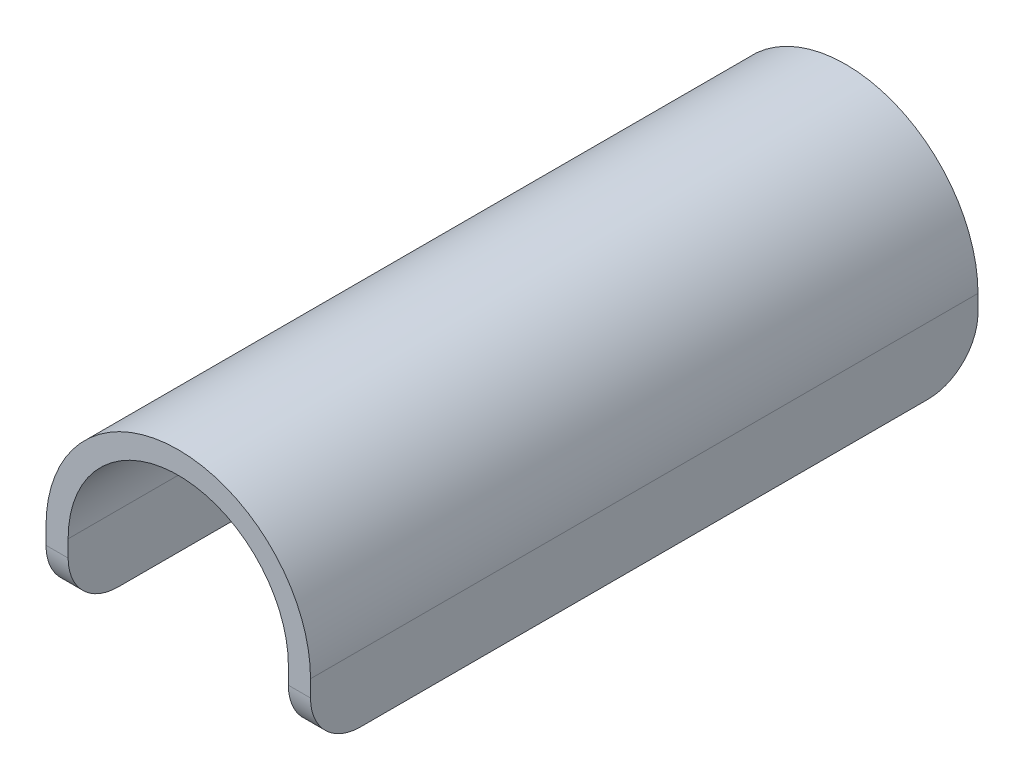
ISO-10303-21;
HEADER;
FILE_DESCRIPTION(('STEP AP214'),'2;1');
FILE_NAME('part.step','',(''),(''),'','','');
FILE_SCHEMA(('AUTOMOTIVE_DESIGN { 1 0 10303 214 1 1 1 1 }'));
ENDSEC;
DATA;
#1=APPLICATION_CONTEXT('core data for automotive mechanical design processes');
#2=APPLICATION_PROTOCOL_DEFINITION('international standard','automotive_design',2000,#1);
#3=PRODUCT_CONTEXT('',#1,'mechanical');
#4=PRODUCT('Part','Part','',(#3));
#5=PRODUCT_RELATED_PRODUCT_CATEGORY('part','',(#4));
#6=PRODUCT_DEFINITION_FORMATION('','',#4);
#7=PRODUCT_DEFINITION_CONTEXT('part definition',#1,'design');
#8=PRODUCT_DEFINITION('design','',#6,#7);
#9=PRODUCT_DEFINITION_SHAPE('','',#8);
#10=(LENGTH_UNIT() NAMED_UNIT(*) SI_UNIT(.MILLI.,.METRE.));
#11=(NAMED_UNIT(*) PLANE_ANGLE_UNIT() SI_UNIT($,.RADIAN.));
#12=(NAMED_UNIT(*) SI_UNIT($,.STERADIAN.) SOLID_ANGLE_UNIT());
#13=UNCERTAINTY_MEASURE_WITH_UNIT(LENGTH_MEASURE(1.E-05),#10,'distance_accuracy_value','');
#14=(GEOMETRIC_REPRESENTATION_CONTEXT(3) GLOBAL_UNCERTAINTY_ASSIGNED_CONTEXT((#13)) GLOBAL_UNIT_ASSIGNED_CONTEXT((#10,
#11,#12)) REPRESENTATION_CONTEXT('',''));
#15=CARTESIAN_POINT('',(0.,0.,0.));
#16=DIRECTION('',(0.,0.,1.));
#17=DIRECTION('',(1.,0.,0.));
#18=AXIS2_PLACEMENT_3D('',#15,#16,#17);
#19=CARTESIAN_POINT('',(0.,0.,200.));
#20=DIRECTION('',(0.,0.,-1.));
#21=DIRECTION('',(-1.,0.,0.));
#22=AXIS2_PLACEMENT_3D('',#19,#20,#21);
#23=CYLINDRICAL_SURFACE('',#22,39.6280261693038);
#24=CARTESIAN_POINT('',(0.,0.,0.));
#25=DIRECTION('',(0.,0.,1.));
#26=DIRECTION('',(1.,0.,0.));
#27=AXIS2_PLACEMENT_3D('',#24,#25,#26);
#28=CIRCLE('',#27,39.6280261693038);
#29=CARTESIAN_POINT('',(39.6280261693038,0.,0.));
#30=VERTEX_POINT('',#29);
#31=CARTESIAN_POINT('',(-39.6280261693038,0.,0.));
#32=VERTEX_POINT('',#31);
#33=EDGE_CURVE('E145',#30,#32,#28,.T.);
#34=ORIENTED_EDGE('',*,*,#33,.T.);
#35=DIRECTION('',(0.,0.,-1.));
#36=VECTOR('',#35,1.);
#37=CARTESIAN_POINT('',(-39.6280261693038,0.,200.));
#38=LINE('',#37,#36);
#39=CARTESIAN_POINT('',(-39.6280261693038,0.,200.));
#40=VERTEX_POINT('',#39);
#41=EDGE_CURVE('E174',#40,#32,#38,.T.);
#42=ORIENTED_EDGE('',*,*,#41,.F.);
#43=CARTESIAN_POINT('',(0.,0.,200.));
#44=DIRECTION('',(0.,0.,1.));
#45=DIRECTION('',(1.,0.,0.));
#46=AXIS2_PLACEMENT_3D('',#43,#44,#45);
#47=CIRCLE('',#46,39.6280261693038);
#48=CARTESIAN_POINT('',(39.6280261693038,0.,200.));
#49=VERTEX_POINT('',#48);
#50=EDGE_CURVE('E158',#49,#40,#47,.T.);
#51=ORIENTED_EDGE('',*,*,#50,.F.);
#52=DIRECTION('',(0.,0.,-1.));
#53=VECTOR('',#52,1.);
#54=CARTESIAN_POINT('',(39.6280261693038,0.,200.));
#55=LINE('',#54,#53);
#56=EDGE_CURVE('E136',#49,#30,#55,.T.);
#57=ORIENTED_EDGE('',*,*,#56,.T.);
#58=EDGE_LOOP('',(#34,#42,#51,#57));
#59=FACE_BOUND('',#58,.T.);
#60=ADVANCED_FACE('F38',(#59),#23,.T.);
#61=CARTESIAN_POINT('',(0.,0.,200.));
#62=DIRECTION('',(0.,0.,-1.));
#63=DIRECTION('',(-1.,0.,0.));
#64=AXIS2_PLACEMENT_3D('',#61,#62,#63);
#65=CYLINDRICAL_SURFACE('',#64,33.);
#66=CARTESIAN_POINT('',(0.,0.,0.));
#67=DIRECTION('',(0.,0.,-1.));
#68=DIRECTION('',(1.,0.,0.));
#69=AXIS2_PLACEMENT_3D('',#66,#67,#68);
#70=CIRCLE('',#69,33.);
#71=CARTESIAN_POINT('',(-33.,0.,0.));
#72=VERTEX_POINT('',#71);
#73=CARTESIAN_POINT('',(33.,0.,0.));
#74=VERTEX_POINT('',#73);
#75=EDGE_CURVE('E154',#72,#74,#70,.T.);
#76=ORIENTED_EDGE('',*,*,#75,.T.);
#77=DIRECTION('',(0.,0.,-1.));
#78=VECTOR('',#77,1.);
#79=CARTESIAN_POINT('',(33.,0.,200.));
#80=LINE('',#79,#78);
#81=CARTESIAN_POINT('',(33.,0.,200.));
#82=VERTEX_POINT('',#81);
#83=EDGE_CURVE('E160',#82,#74,#80,.T.);
#84=ORIENTED_EDGE('',*,*,#83,.F.);
#85=CARTESIAN_POINT('',(0.,0.,200.));
#86=DIRECTION('',(0.,0.,-1.));
#87=DIRECTION('',(1.,0.,0.));
#88=AXIS2_PLACEMENT_3D('',#85,#86,#87);
#89=CIRCLE('',#88,33.);
#90=CARTESIAN_POINT('',(-33.,0.,200.));
#91=VERTEX_POINT('',#90);
#92=EDGE_CURVE('E161',#91,#82,#89,.T.);
#93=ORIENTED_EDGE('',*,*,#92,.F.);
#94=DIRECTION('',(0.,0.,-1.));
#95=VECTOR('',#94,1.);
#96=CARTESIAN_POINT('',(-33.,0.,200.));
#97=LINE('',#96,#95);
#98=EDGE_CURVE('E166',#91,#72,#97,.T.);
#99=ORIENTED_EDGE('',*,*,#98,.T.);
#100=EDGE_LOOP('',(#76,#84,#93,#99));
#101=FACE_BOUND('',#100,.T.);
#102=ADVANCED_FACE('F259',(#101),#65,.F.);
#103=CARTESIAN_POINT('',(0.,0.,200.));
#104=DIRECTION('',(0.,0.,1.));
#105=DIRECTION('',(1.,0.,0.));
#106=AXIS2_PLACEMENT_3D('',#103,#104,#105);
#107=PLANE('',#106);
#108=DIRECTION('',(0.,-1.,0.));
#109=VECTOR('',#108,1.);
#110=CARTESIAN_POINT('',(33.,0.,200.));
#111=LINE('',#110,#109);
#112=CARTESIAN_POINT('',(33.,-5.,200.));
#113=VERTEX_POINT('',#112);
#114=EDGE_CURVE('E141',#82,#113,#111,.T.);
#115=ORIENTED_EDGE('',*,*,#114,.T.);
#116=DIRECTION('',(1.,0.,0.));
#117=VECTOR('',#116,1.);
#118=CARTESIAN_POINT('',(39.6280261693038,-5.,200.));
#119=LINE('',#118,#117);
#120=CARTESIAN_POINT('',(39.6280261693038,-5.,200.));
#121=VERTEX_POINT('',#120);
#122=EDGE_CURVE('E11',#113,#121,#119,.T.);
#123=ORIENTED_EDGE('',*,*,#122,.T.);
#124=DIRECTION('',(0.,1.,0.));
#125=VECTOR('',#124,1.);
#126=CARTESIAN_POINT('',(39.6280261693038,-20.,200.));
#127=LINE('',#126,#125);
#128=EDGE_CURVE('E266',#121,#49,#127,.T.);
#129=ORIENTED_EDGE('',*,*,#128,.T.);
#130=ORIENTED_EDGE('',*,*,#50,.T.);
#131=DIRECTION('',(0.,-1.,0.));
#132=VECTOR('',#131,1.);
#133=CARTESIAN_POINT('',(-39.6280261693038,0.,200.));
#134=LINE('',#133,#132);
#135=CARTESIAN_POINT('',(-39.6280261693038,-5.,200.));
#136=VERTEX_POINT('',#135);
#137=EDGE_CURVE('E227',#40,#136,#134,.T.);
#138=ORIENTED_EDGE('',*,*,#137,.T.);
#139=DIRECTION('',(1.,0.,0.));
#140=VECTOR('',#139,1.);
#141=CARTESIAN_POINT('',(-33.,-5.,200.));
#142=LINE('',#141,#140);
#143=CARTESIAN_POINT('',(-33.,-5.,200.));
#144=VERTEX_POINT('',#143);
#145=EDGE_CURVE('E47',#136,#144,#142,.T.);
#146=ORIENTED_EDGE('',*,*,#145,.T.);
#147=DIRECTION('',(0.,1.,0.));
#148=VECTOR('',#147,1.);
#149=CARTESIAN_POINT('',(-33.,0.,200.));
#150=LINE('',#149,#148);
#151=EDGE_CURVE('E224',#144,#91,#150,.T.);
#152=ORIENTED_EDGE('',*,*,#151,.T.);
#153=ORIENTED_EDGE('',*,*,#92,.T.);
#154=EDGE_LOOP('',(#115,#123,#129,#130,#138,#146,#152,#153));
#155=FACE_BOUND('',#154,.T.);
#156=ADVANCED_FACE('F223',(#155),#107,.T.);
#157=CARTESIAN_POINT('',(0.,0.,0.));
#158=DIRECTION('',(0.,0.,1.));
#159=DIRECTION('',(1.,0.,0.));
#160=AXIS2_PLACEMENT_3D('',#157,#158,#159);
#161=PLANE('',#160);
#162=DIRECTION('',(0.,1.,0.));
#163=VECTOR('',#162,1.);
#164=CARTESIAN_POINT('',(-33.,0.,0.));
#165=LINE('',#164,#163);
#166=CARTESIAN_POINT('',(-33.,-5.,0.));
#167=VERTEX_POINT('',#166);
#168=EDGE_CURVE('E241',#167,#72,#165,.T.);
#169=ORIENTED_EDGE('',*,*,#168,.F.);
#170=DIRECTION('',(1.,0.,0.));
#171=VECTOR('',#170,1.);
#172=CARTESIAN_POINT('',(0.,-5.,0.));
#173=LINE('',#172,#171);
#174=CARTESIAN_POINT('',(-39.6280261693038,-5.,0.));
#175=VERTEX_POINT('',#174);
#176=EDGE_CURVE('E193',#167,#175,#173,.F.);
#177=ORIENTED_EDGE('',*,*,#176,.T.);
#178=DIRECTION('',(0.,-1.,0.));
#179=VECTOR('',#178,1.);
#180=CARTESIAN_POINT('',(-39.6280261693038,0.,0.));
#181=LINE('',#180,#179);
#182=EDGE_CURVE('E149',#32,#175,#181,.T.);
#183=ORIENTED_EDGE('',*,*,#182,.F.);
#184=ORIENTED_EDGE('',*,*,#33,.F.);
#185=DIRECTION('',(0.,1.,0.));
#186=VECTOR('',#185,1.);
#187=CARTESIAN_POINT('',(39.6280261693038,-20.,0.));
#188=LINE('',#187,#186);
#189=CARTESIAN_POINT('',(39.6280261693038,-5.,0.));
#190=VERTEX_POINT('',#189);
#191=EDGE_CURVE('E130',#190,#30,#188,.T.);
#192=ORIENTED_EDGE('',*,*,#191,.F.);
#193=DIRECTION('',(1.,0.,0.));
#194=VECTOR('',#193,1.);
#195=CARTESIAN_POINT('',(0.,-5.,0.));
#196=LINE('',#195,#194);
#197=CARTESIAN_POINT('',(33.,-5.,0.));
#198=VERTEX_POINT('',#197);
#199=EDGE_CURVE('E190',#190,#198,#196,.F.);
#200=ORIENTED_EDGE('',*,*,#199,.T.);
#201=DIRECTION('',(0.,-1.,0.));
#202=VECTOR('',#201,1.);
#203=CARTESIAN_POINT('',(33.,0.,0.));
#204=LINE('',#203,#202);
#205=EDGE_CURVE('E142',#74,#198,#204,.T.);
#206=ORIENTED_EDGE('',*,*,#205,.F.);
#207=ORIENTED_EDGE('',*,*,#75,.F.);
#208=EDGE_LOOP('',(#169,#177,#183,#184,#192,#200,#206,#207));
#209=FACE_BOUND('',#208,.T.);
#210=ADVANCED_FACE('F147',(#209),#161,.F.);
#211=CARTESIAN_POINT('',(-39.6280261693038,0.,200.));
#212=DIRECTION('',(1.,0.,0.));
#213=DIRECTION('',(0.,0.,-1.));
#214=AXIS2_PLACEMENT_3D('',#211,#212,#213);
#215=PLANE('',#214);
#216=ORIENTED_EDGE('',*,*,#182,.T.);
#217=CARTESIAN_POINT('',(-39.6280261693038,-5.,15.));
#218=DIRECTION('',(1.,0.,0.));
#219=DIRECTION('',(0.,0.,-1.));
#220=AXIS2_PLACEMENT_3D('',#217,#218,#219);
#221=CIRCLE('',#220,15.);
#222=CARTESIAN_POINT('',(-39.6280261693038,-20.,15.));
#223=VERTEX_POINT('',#222);
#224=EDGE_CURVE('E199',#175,#223,#221,.F.);
#225=ORIENTED_EDGE('',*,*,#224,.T.);
#226=DIRECTION('',(0.,0.,-1.));
#227=VECTOR('',#226,1.);
#228=CARTESIAN_POINT('',(-39.6280261693038,-20.,200.));
#229=LINE('',#228,#227);
#230=CARTESIAN_POINT('',(-39.6280261693038,-20.,185.));
#231=VERTEX_POINT('',#230);
#232=EDGE_CURVE('E155',#231,#223,#229,.T.);
#233=ORIENTED_EDGE('',*,*,#232,.F.);
#234=CARTESIAN_POINT('',(-39.6280261693038,-5.,185.));
#235=DIRECTION('',(1.,0.,0.));
#236=DIRECTION('',(0.,0.,-1.));
#237=AXIS2_PLACEMENT_3D('',#234,#235,#236);
#238=CIRCLE('',#237,15.);
#239=EDGE_CURVE('E196',#231,#136,#238,.F.);
#240=ORIENTED_EDGE('',*,*,#239,.T.);
#241=ORIENTED_EDGE('',*,*,#137,.F.);
#242=ORIENTED_EDGE('',*,*,#41,.T.);
#243=EDGE_LOOP('',(#216,#225,#233,#240,#241,#242));
#244=FACE_BOUND('',#243,.T.);
#245=ADVANCED_FACE('F300',(#244),#215,.F.);
#246=CARTESIAN_POINT('',(-33.,-20.,200.));
#247=DIRECTION('',(0.,1.,0.));
#248=DIRECTION('',(0.,0.,1.));
#249=AXIS2_PLACEMENT_3D('',#246,#247,#248);
#250=PLANE('',#249);
#251=ORIENTED_EDGE('',*,*,#232,.T.);
#252=DIRECTION('',(1.,0.,0.));
#253=VECTOR('',#252,1.);
#254=CARTESIAN_POINT('',(-33.,-20.,15.));
#255=LINE('',#254,#253);
#256=CARTESIAN_POINT('',(-33.,-20.,15.));
#257=VERTEX_POINT('',#256);
#258=EDGE_CURVE('E180',#223,#257,#255,.T.);
#259=ORIENTED_EDGE('',*,*,#258,.T.);
#260=DIRECTION('',(0.,0.,-1.));
#261=VECTOR('',#260,1.);
#262=CARTESIAN_POINT('',(-33.,-20.,200.));
#263=LINE('',#262,#261);
#264=CARTESIAN_POINT('',(-33.,-20.,185.));
#265=VERTEX_POINT('',#264);
#266=EDGE_CURVE('E236',#265,#257,#263,.T.);
#267=ORIENTED_EDGE('',*,*,#266,.F.);
#268=DIRECTION('',(1.,0.,0.));
#269=VECTOR('',#268,1.);
#270=CARTESIAN_POINT('',(-39.6280261693038,-20.,185.));
#271=LINE('',#270,#269);
#272=EDGE_CURVE('E177',#265,#231,#271,.F.);
#273=ORIENTED_EDGE('',*,*,#272,.T.);
#274=EDGE_LOOP('',(#251,#259,#267,#273));
#275=FACE_BOUND('',#274,.T.);
#276=ADVANCED_FACE('F305',(#275),#250,.F.);
#277=CARTESIAN_POINT('',(-33.,0.,200.));
#278=DIRECTION('',(-1.,0.,0.));
#279=DIRECTION('',(0.,0.,1.));
#280=AXIS2_PLACEMENT_3D('',#277,#278,#279);
#281=PLANE('',#280);
#282=ORIENTED_EDGE('',*,*,#266,.T.);
#283=CARTESIAN_POINT('',(-33.,-5.,15.));
#284=DIRECTION('',(-1.,0.,0.));
#285=DIRECTION('',(0.,0.,1.));
#286=AXIS2_PLACEMENT_3D('',#283,#284,#285);
#287=CIRCLE('',#286,15.);
#288=EDGE_CURVE('E187',#257,#167,#287,.F.);
#289=ORIENTED_EDGE('',*,*,#288,.T.);
#290=ORIENTED_EDGE('',*,*,#168,.T.);
#291=ORIENTED_EDGE('',*,*,#98,.F.);
#292=ORIENTED_EDGE('',*,*,#151,.F.);
#293=CARTESIAN_POINT('',(-33.,-5.,185.));
#294=DIRECTION('',(-1.,0.,0.));
#295=DIRECTION('',(0.,0.,1.));
#296=AXIS2_PLACEMENT_3D('',#293,#294,#295);
#297=CIRCLE('',#296,15.);
#298=EDGE_CURVE('E184',#144,#265,#297,.F.);
#299=ORIENTED_EDGE('',*,*,#298,.T.);
#300=EDGE_LOOP('',(#282,#289,#290,#291,#292,#299));
#301=FACE_BOUND('',#300,.T.);
#302=ADVANCED_FACE('F233',(#301),#281,.F.);
#303=CARTESIAN_POINT('',(33.,0.,200.));
#304=DIRECTION('',(1.,0.,0.));
#305=DIRECTION('',(0.,0.,-1.));
#306=AXIS2_PLACEMENT_3D('',#303,#304,#305);
#307=PLANE('',#306);
#308=ORIENTED_EDGE('',*,*,#205,.T.);
#309=CARTESIAN_POINT('',(33.,-5.,15.));
#310=DIRECTION('',(1.,0.,0.));
#311=DIRECTION('',(0.,0.,-1.));
#312=AXIS2_PLACEMENT_3D('',#309,#310,#311);
#313=CIRCLE('',#312,15.);
#314=CARTESIAN_POINT('',(33.,-20.,15.));
#315=VERTEX_POINT('',#314);
#316=EDGE_CURVE('E215',#198,#315,#313,.F.);
#317=ORIENTED_EDGE('',*,*,#316,.T.);
#318=DIRECTION('',(0.,0.,-1.));
#319=VECTOR('',#318,1.);
#320=CARTESIAN_POINT('',(33.,-20.,200.));
#321=LINE('',#320,#319);
#322=CARTESIAN_POINT('',(33.,-20.,185.));
#323=VERTEX_POINT('',#322);
#324=EDGE_CURVE('E247',#323,#315,#321,.T.);
#325=ORIENTED_EDGE('',*,*,#324,.F.);
#326=CARTESIAN_POINT('',(33.,-5.,185.));
#327=DIRECTION('',(1.,0.,0.));
#328=DIRECTION('',(0.,0.,-1.));
#329=AXIS2_PLACEMENT_3D('',#326,#327,#328);
#330=CIRCLE('',#329,15.);
#331=EDGE_CURVE('E54',#323,#113,#330,.F.);
#332=ORIENTED_EDGE('',*,*,#331,.T.);
#333=ORIENTED_EDGE('',*,*,#114,.F.);
#334=ORIENTED_EDGE('',*,*,#83,.T.);
#335=EDGE_LOOP('',(#308,#317,#325,#332,#333,#334));
#336=FACE_BOUND('',#335,.T.);
#337=ADVANCED_FACE('F264',(#336),#307,.F.);
#338=CARTESIAN_POINT('',(33.,-20.,200.));
#339=DIRECTION('',(0.,1.,0.));
#340=DIRECTION('',(0.,0.,1.));
#341=AXIS2_PLACEMENT_3D('',#338,#339,#340);
#342=PLANE('',#341);
#343=ORIENTED_EDGE('',*,*,#324,.T.);
#344=DIRECTION('',(1.,0.,0.));
#345=VECTOR('',#344,1.);
#346=CARTESIAN_POINT('',(33.,-20.,15.));
#347=LINE('',#346,#345);
#348=CARTESIAN_POINT('',(39.6280261693038,-20.,15.));
#349=VERTEX_POINT('',#348);
#350=EDGE_CURVE('E205',#315,#349,#347,.T.);
#351=ORIENTED_EDGE('',*,*,#350,.T.);
#352=DIRECTION('',(0.,0.,-1.));
#353=VECTOR('',#352,1.);
#354=CARTESIAN_POINT('',(39.6280261693038,-20.,200.));
#355=LINE('',#354,#353);
#356=CARTESIAN_POINT('',(39.6280261693038,-20.,185.));
#357=VERTEX_POINT('',#356);
#358=EDGE_CURVE('E269',#357,#349,#355,.T.);
#359=ORIENTED_EDGE('',*,*,#358,.F.);
#360=DIRECTION('',(1.,0.,0.));
#361=VECTOR('',#360,1.);
#362=CARTESIAN_POINT('',(33.,-20.,185.));
#363=LINE('',#362,#361);
#364=EDGE_CURVE('E202',#357,#323,#363,.F.);
#365=ORIENTED_EDGE('',*,*,#364,.T.);
#366=EDGE_LOOP('',(#343,#351,#359,#365));
#367=FACE_BOUND('',#366,.T.);
#368=ADVANCED_FACE('F277',(#367),#342,.F.);
#369=CARTESIAN_POINT('',(39.6280261693038,-20.,200.));
#370=DIRECTION('',(-1.,0.,0.));
#371=DIRECTION('',(0.,0.,1.));
#372=AXIS2_PLACEMENT_3D('',#369,#370,#371);
#373=PLANE('',#372);
#374=ORIENTED_EDGE('',*,*,#358,.T.);
#375=CARTESIAN_POINT('',(39.6280261693038,-5.,15.));
#376=DIRECTION('',(-1.,0.,0.));
#377=DIRECTION('',(0.,0.,1.));
#378=AXIS2_PLACEMENT_3D('',#375,#376,#377);
#379=CIRCLE('',#378,15.);
#380=EDGE_CURVE('E137',#349,#190,#379,.F.);
#381=ORIENTED_EDGE('',*,*,#380,.T.);
#382=ORIENTED_EDGE('',*,*,#191,.T.);
#383=ORIENTED_EDGE('',*,*,#56,.F.);
#384=ORIENTED_EDGE('',*,*,#128,.F.);
#385=CARTESIAN_POINT('',(39.6280261693038,-5.,185.));
#386=DIRECTION('',(-1.,0.,0.));
#387=DIRECTION('',(0.,0.,1.));
#388=AXIS2_PLACEMENT_3D('',#385,#386,#387);
#389=CIRCLE('',#388,15.);
#390=EDGE_CURVE('E62',#121,#357,#389,.F.);
#391=ORIENTED_EDGE('',*,*,#390,.T.);
#392=EDGE_LOOP('',(#374,#381,#382,#383,#384,#391));
#393=FACE_BOUND('',#392,.T.);
#394=ADVANCED_FACE('F133',(#393),#373,.F.);
#395=CARTESIAN_POINT('',(-33.,-5.,15.));
#396=DIRECTION('',(1.,0.,0.));
#397=DIRECTION('',(0.,0.,-1.));
#398=AXIS2_PLACEMENT_3D('',#395,#396,#397);
#399=CYLINDRICAL_SURFACE('',#398,15.);
#400=ORIENTED_EDGE('',*,*,#224,.F.);
#401=ORIENTED_EDGE('',*,*,#176,.F.);
#402=ORIENTED_EDGE('',*,*,#288,.F.);
#403=ORIENTED_EDGE('',*,*,#258,.F.);
#404=EDGE_LOOP('',(#400,#401,#402,#403));
#405=FACE_BOUND('',#404,.T.);
#406=ADVANCED_FACE('F283',(#405),#399,.T.);
#407=CARTESIAN_POINT('',(33.,-5.,15.));
#408=DIRECTION('',(1.,0.,0.));
#409=DIRECTION('',(0.,0.,-1.));
#410=AXIS2_PLACEMENT_3D('',#407,#408,#409);
#411=CYLINDRICAL_SURFACE('',#410,15.);
#412=ORIENTED_EDGE('',*,*,#316,.F.);
#413=ORIENTED_EDGE('',*,*,#199,.F.);
#414=ORIENTED_EDGE('',*,*,#380,.F.);
#415=ORIENTED_EDGE('',*,*,#350,.F.);
#416=EDGE_LOOP('',(#412,#413,#414,#415));
#417=FACE_BOUND('',#416,.T.);
#418=ADVANCED_FACE('F280',(#417),#411,.T.);
#419=CARTESIAN_POINT('',(0.,-5.,185.));
#420=DIRECTION('',(-1.,0.,0.));
#421=DIRECTION('',(0.,0.,1.));
#422=AXIS2_PLACEMENT_3D('',#419,#420,#421);
#423=CYLINDRICAL_SURFACE('',#422,15.);
#424=ORIENTED_EDGE('',*,*,#331,.F.);
#425=ORIENTED_EDGE('',*,*,#364,.F.);
#426=ORIENTED_EDGE('',*,*,#390,.F.);
#427=ORIENTED_EDGE('',*,*,#122,.F.);
#428=EDGE_LOOP('',(#424,#425,#426,#427));
#429=FACE_BOUND('',#428,.T.);
#430=ADVANCED_FACE('F282',(#429),#423,.T.);
#431=CARTESIAN_POINT('',(0.,-5.,185.));
#432=DIRECTION('',(-1.,0.,0.));
#433=DIRECTION('',(0.,0.,1.));
#434=AXIS2_PLACEMENT_3D('',#431,#432,#433);
#435=CYLINDRICAL_SURFACE('',#434,15.);
#436=ORIENTED_EDGE('',*,*,#239,.F.);
#437=ORIENTED_EDGE('',*,*,#272,.F.);
#438=ORIENTED_EDGE('',*,*,#298,.F.);
#439=ORIENTED_EDGE('',*,*,#145,.F.);
#440=EDGE_LOOP('',(#436,#437,#438,#439));
#441=FACE_BOUND('',#440,.T.);
#442=ADVANCED_FACE('F40',(#441),#435,.T.);
#443=CLOSED_SHELL('',(#60,#102,#156,#210,#245,#276,#302,#337,#368,#394,#406,#418,#430,#442));
#444=MANIFOLD_SOLID_BREP('B2',#443);
#445=ADVANCED_BREP_SHAPE_REPRESENTATION('',(#18,#444),#14);
#446=SHAPE_DEFINITION_REPRESENTATION(#9,#445);
ENDSEC;
END-ISO-10303-21;
